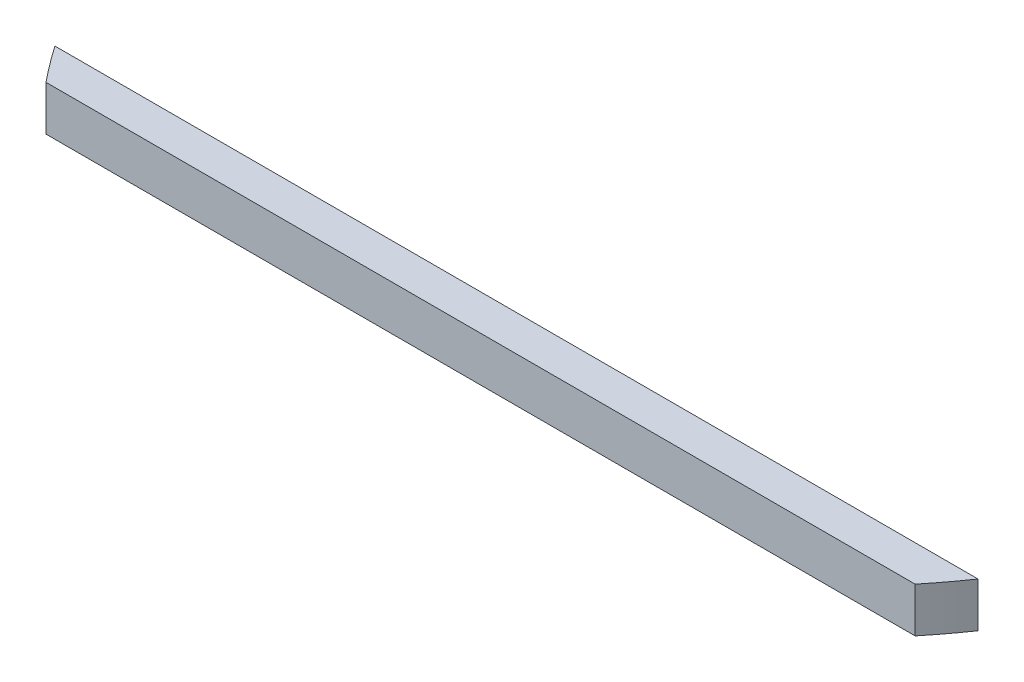
ISO-10303-21;
HEADER;
FILE_DESCRIPTION(('STEP AP214'),'2;1');
FILE_NAME('part.step','',(''),(''),'','','');
FILE_SCHEMA(('AUTOMOTIVE_DESIGN { 1 0 10303 214 1 1 1 1 }'));
ENDSEC;
DATA;
#1=APPLICATION_CONTEXT('core data for automotive mechanical design processes');
#2=APPLICATION_PROTOCOL_DEFINITION('international standard','automotive_design',2000,#1);
#3=PRODUCT_CONTEXT('',#1,'mechanical');
#4=PRODUCT('Part','Part','',(#3));
#5=PRODUCT_RELATED_PRODUCT_CATEGORY('part','',(#4));
#6=PRODUCT_DEFINITION_FORMATION('','',#4);
#7=PRODUCT_DEFINITION_CONTEXT('part definition',#1,'design');
#8=PRODUCT_DEFINITION('design','',#6,#7);
#9=PRODUCT_DEFINITION_SHAPE('','',#8);
#10=(LENGTH_UNIT() NAMED_UNIT(*) SI_UNIT(.MILLI.,.METRE.));
#11=(NAMED_UNIT(*) PLANE_ANGLE_UNIT() SI_UNIT($,.RADIAN.));
#12=(NAMED_UNIT(*) SI_UNIT($,.STERADIAN.) SOLID_ANGLE_UNIT());
#13=UNCERTAINTY_MEASURE_WITH_UNIT(LENGTH_MEASURE(1.E-05),#10,'distance_accuracy_value','');
#14=(GEOMETRIC_REPRESENTATION_CONTEXT(3) GLOBAL_UNCERTAINTY_ASSIGNED_CONTEXT((#13)) GLOBAL_UNIT_ASSIGNED_CONTEXT((#10,
#11,#12)) REPRESENTATION_CONTEXT('',''));
#15=CARTESIAN_POINT('',(0.,0.,0.));
#16=DIRECTION('',(0.,0.,1.));
#17=DIRECTION('',(1.,0.,0.));
#18=AXIS2_PLACEMENT_3D('',#15,#16,#17);
#19=CARTESIAN_POINT('',(0.,5.,0.));
#20=DIRECTION('',(0.,-1.,0.));
#21=DIRECTION('',(0.,0.,-1.));
#22=AXIS2_PLACEMENT_3D('',#19,#20,#21);
#23=CYLINDRICAL_SURFACE('',#22,62.5);
#24=CARTESIAN_POINT('',(0.,0.,0.));
#25=DIRECTION('',(0.,1.,0.));
#26=DIRECTION('',(0.,0.,1.));
#27=AXIS2_PLACEMENT_3D('',#24,#25,#26);
#28=CIRCLE('',#27,62.5);
#29=CARTESIAN_POINT('',(-51.4392845984467,0.,35.5));
#30=VERTEX_POINT('',#29);
#31=CARTESIAN_POINT('',(-48.4355241532493,0.,39.5));
#32=VERTEX_POINT('',#31);
#33=EDGE_CURVE('E96',#30,#32,#28,.T.);
#34=ORIENTED_EDGE('',*,*,#33,.T.);
#35=DIRECTION('',(0.,-1.,0.));
#36=VECTOR('',#35,1.);
#37=CARTESIAN_POINT('',(-48.4355241532493,5.,39.5));
#38=LINE('',#37,#36);
#39=CARTESIAN_POINT('',(-48.4355241532493,5.,39.5));
#40=VERTEX_POINT('',#39);
#41=EDGE_CURVE('E11',#40,#32,#38,.T.);
#42=ORIENTED_EDGE('',*,*,#41,.F.);
#43=CARTESIAN_POINT('',(0.,5.,0.));
#44=DIRECTION('',(0.,1.,0.));
#45=DIRECTION('',(0.,0.,1.));
#46=AXIS2_PLACEMENT_3D('',#43,#44,#45);
#47=CIRCLE('',#46,62.5);
#48=CARTESIAN_POINT('',(-51.4392845984467,5.,35.5));
#49=VERTEX_POINT('',#48);
#50=EDGE_CURVE('E84',#49,#40,#47,.T.);
#51=ORIENTED_EDGE('',*,*,#50,.F.);
#52=DIRECTION('',(0.,-1.,0.));
#53=VECTOR('',#52,1.);
#54=CARTESIAN_POINT('',(-51.4392845984467,5.,35.5));
#55=LINE('',#54,#53);
#56=EDGE_CURVE('E92',#49,#30,#55,.T.);
#57=ORIENTED_EDGE('',*,*,#56,.T.);
#58=EDGE_LOOP('',(#34,#42,#51,#57));
#59=FACE_BOUND('',#58,.T.);
#60=ADVANCED_FACE('F33',(#59),#23,.T.);
#61=CARTESIAN_POINT('',(-48.4355241532493,5.,39.5));
#62=DIRECTION('',(0.,0.,-1.));
#63=DIRECTION('',(-1.,0.,0.));
#64=AXIS2_PLACEMENT_3D('',#61,#62,#63);
#65=PLANE('',#64);
#66=DIRECTION('',(1.,0.,0.));
#67=VECTOR('',#66,1.);
#68=CARTESIAN_POINT('',(-48.4355241532493,0.,39.5));
#69=LINE('',#68,#67);
#70=CARTESIAN_POINT('',(48.4355241532493,0.,39.5));
#71=VERTEX_POINT('',#70);
#72=EDGE_CURVE('E88',#32,#71,#69,.T.);
#73=ORIENTED_EDGE('',*,*,#72,.T.);
#74=DIRECTION('',(0.,-1.,0.));
#75=VECTOR('',#74,1.);
#76=CARTESIAN_POINT('',(48.4355241532493,5.,39.5));
#77=LINE('',#76,#75);
#78=CARTESIAN_POINT('',(48.4355241532493,5.,39.5));
#79=VERTEX_POINT('',#78);
#80=EDGE_CURVE('E41',#79,#71,#77,.T.);
#81=ORIENTED_EDGE('',*,*,#80,.F.);
#82=DIRECTION('',(1.,0.,0.));
#83=VECTOR('',#82,1.);
#84=CARTESIAN_POINT('',(-48.4355241532493,5.,39.5));
#85=LINE('',#84,#83);
#86=EDGE_CURVE('E79',#40,#79,#85,.T.);
#87=ORIENTED_EDGE('',*,*,#86,.F.);
#88=ORIENTED_EDGE('',*,*,#41,.T.);
#89=EDGE_LOOP('',(#73,#81,#87,#88));
#90=FACE_BOUND('',#89,.T.);
#91=ADVANCED_FACE('F87',(#90),#65,.F.);
#92=CARTESIAN_POINT('',(0.,5.,0.));
#93=DIRECTION('',(0.,-1.,0.));
#94=DIRECTION('',(0.,0.,-1.));
#95=AXIS2_PLACEMENT_3D('',#92,#93,#94);
#96=CYLINDRICAL_SURFACE('',#95,62.5);
#97=CARTESIAN_POINT('',(0.,0.,0.));
#98=DIRECTION('',(0.,1.,0.));
#99=DIRECTION('',(0.,0.,1.));
#100=AXIS2_PLACEMENT_3D('',#97,#98,#99);
#101=CIRCLE('',#100,62.5);
#102=CARTESIAN_POINT('',(51.4392845984467,0.,35.5));
#103=VERTEX_POINT('',#102);
#104=EDGE_CURVE('E66',#71,#103,#101,.T.);
#105=ORIENTED_EDGE('',*,*,#104,.T.);
#106=DIRECTION('',(0.,-1.,0.));
#107=VECTOR('',#106,1.);
#108=CARTESIAN_POINT('',(51.4392845984467,5.,35.5));
#109=LINE('',#108,#107);
#110=CARTESIAN_POINT('',(51.4392845984467,5.,35.5));
#111=VERTEX_POINT('',#110);
#112=EDGE_CURVE('E89',#111,#103,#109,.T.);
#113=ORIENTED_EDGE('',*,*,#112,.F.);
#114=CARTESIAN_POINT('',(0.,5.,0.));
#115=DIRECTION('',(0.,1.,0.));
#116=DIRECTION('',(0.,0.,1.));
#117=AXIS2_PLACEMENT_3D('',#114,#115,#116);
#118=CIRCLE('',#117,62.5);
#119=EDGE_CURVE('E82',#79,#111,#118,.T.);
#120=ORIENTED_EDGE('',*,*,#119,.F.);
#121=ORIENTED_EDGE('',*,*,#80,.T.);
#122=EDGE_LOOP('',(#105,#113,#120,#121));
#123=FACE_BOUND('',#122,.T.);
#124=ADVANCED_FACE('F90',(#123),#96,.T.);
#125=CARTESIAN_POINT('',(-51.4392845984467,5.,35.5));
#126=DIRECTION('',(0.,0.,1.));
#127=DIRECTION('',(1.,0.,0.));
#128=AXIS2_PLACEMENT_3D('',#125,#126,#127);
#129=PLANE('',#128);
#130=DIRECTION('',(-1.,0.,0.));
#131=VECTOR('',#130,1.);
#132=CARTESIAN_POINT('',(-51.4392845984467,0.,35.5));
#133=LINE('',#132,#131);
#134=EDGE_CURVE('E72',#103,#30,#133,.T.);
#135=ORIENTED_EDGE('',*,*,#134,.T.);
#136=ORIENTED_EDGE('',*,*,#56,.F.);
#137=DIRECTION('',(-1.,0.,0.));
#138=VECTOR('',#137,1.);
#139=CARTESIAN_POINT('',(-51.4392845984467,5.,35.5));
#140=LINE('',#139,#138);
#141=EDGE_CURVE('E49',#111,#49,#140,.T.);
#142=ORIENTED_EDGE('',*,*,#141,.F.);
#143=ORIENTED_EDGE('',*,*,#112,.T.);
#144=EDGE_LOOP('',(#135,#136,#142,#143));
#145=FACE_BOUND('',#144,.T.);
#146=ADVANCED_FACE('F103',(#145),#129,.F.);
#147=CARTESIAN_POINT('',(0.,5.,0.));
#148=DIRECTION('',(0.,1.,0.));
#149=DIRECTION('',(0.,0.,1.));
#150=AXIS2_PLACEMENT_3D('',#147,#148,#149);
#151=PLANE('',#150);
#152=ORIENTED_EDGE('',*,*,#50,.T.);
#153=ORIENTED_EDGE('',*,*,#86,.T.);
#154=ORIENTED_EDGE('',*,*,#119,.T.);
#155=ORIENTED_EDGE('',*,*,#141,.T.);
#156=EDGE_LOOP('',(#152,#153,#154,#155));
#157=FACE_BOUND('',#156,.T.);
#158=ADVANCED_FACE('F80',(#157),#151,.T.);
#159=CARTESIAN_POINT('',(0.,0.,0.));
#160=DIRECTION('',(0.,1.,0.));
#161=DIRECTION('',(0.,0.,1.));
#162=AXIS2_PLACEMENT_3D('',#159,#160,#161);
#163=PLANE('',#162);
#164=ORIENTED_EDGE('',*,*,#33,.F.);
#165=ORIENTED_EDGE('',*,*,#134,.F.);
#166=ORIENTED_EDGE('',*,*,#104,.F.);
#167=ORIENTED_EDGE('',*,*,#72,.F.);
#168=EDGE_LOOP('',(#164,#165,#166,#167));
#169=FACE_BOUND('',#168,.T.);
#170=ADVANCED_FACE('F106',(#169),#163,.F.);
#171=CLOSED_SHELL('',(#60,#91,#124,#146,#158,#170));
#172=MANIFOLD_SOLID_BREP('B2',#171);
#173=ADVANCED_BREP_SHAPE_REPRESENTATION('',(#18,#172),#14);
#174=SHAPE_DEFINITION_REPRESENTATION(#9,#173);
ENDSEC;
END-ISO-10303-21;
